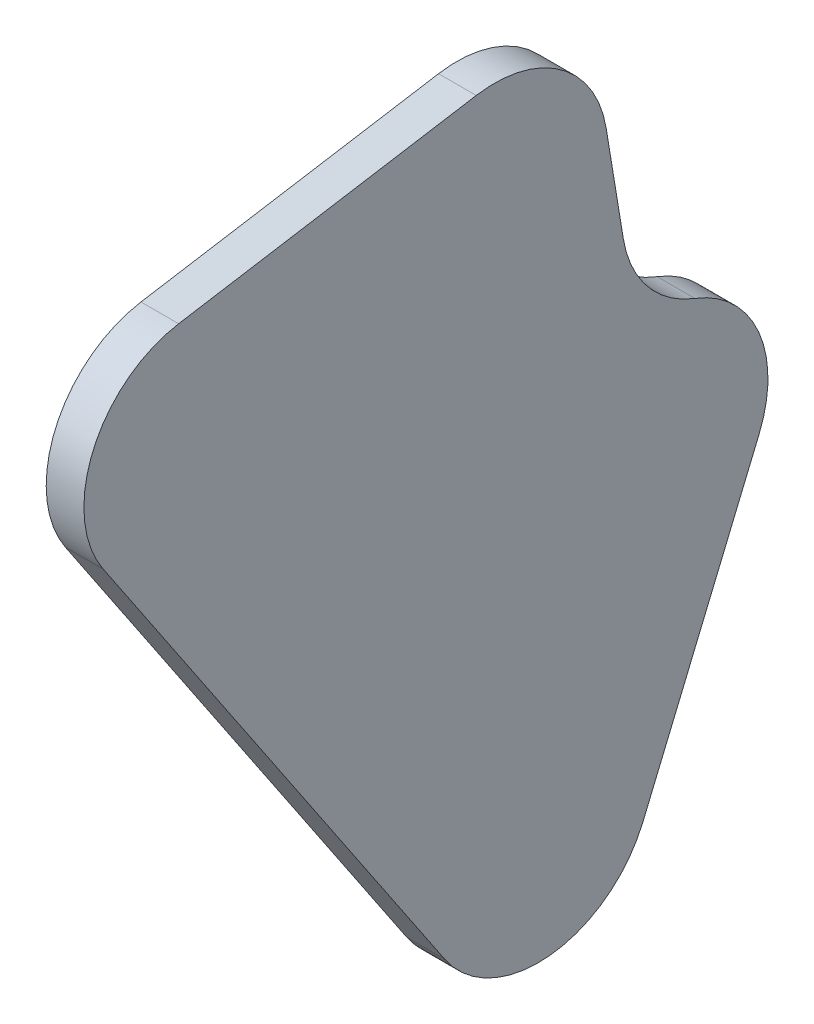
ISO-10303-21;
HEADER;
FILE_DESCRIPTION(('STEP AP214'),'2;1');
FILE_NAME('part.step','',(''),(''),'','','');
FILE_SCHEMA(('AUTOMOTIVE_DESIGN { 1 0 10303 214 1 1 1 1 }'));
ENDSEC;
DATA;
#1=APPLICATION_CONTEXT('core data for automotive mechanical design processes');
#2=APPLICATION_PROTOCOL_DEFINITION('international standard','automotive_design',2000,#1);
#3=PRODUCT_CONTEXT('',#1,'mechanical');
#4=PRODUCT('Part','Part','',(#3));
#5=PRODUCT_RELATED_PRODUCT_CATEGORY('part','',(#4));
#6=PRODUCT_DEFINITION_FORMATION('','',#4);
#7=PRODUCT_DEFINITION_CONTEXT('part definition',#1,'design');
#8=PRODUCT_DEFINITION('design','',#6,#7);
#9=PRODUCT_DEFINITION_SHAPE('','',#8);
#10=(LENGTH_UNIT() NAMED_UNIT(*) SI_UNIT(.MILLI.,.METRE.));
#11=(NAMED_UNIT(*) PLANE_ANGLE_UNIT() SI_UNIT($,.RADIAN.));
#12=(NAMED_UNIT(*) SI_UNIT($,.STERADIAN.) SOLID_ANGLE_UNIT());
#13=UNCERTAINTY_MEASURE_WITH_UNIT(LENGTH_MEASURE(1.E-05),#10,'distance_accuracy_value','');
#14=(GEOMETRIC_REPRESENTATION_CONTEXT(3) GLOBAL_UNCERTAINTY_ASSIGNED_CONTEXT((#13)) GLOBAL_UNIT_ASSIGNED_CONTEXT((#10,
#11,#12)) REPRESENTATION_CONTEXT('',''));
#15=CARTESIAN_POINT('',(0.,0.,0.));
#16=DIRECTION('',(0.,0.,1.));
#17=DIRECTION('',(1.,0.,0.));
#18=AXIS2_PLACEMENT_3D('',#15,#16,#17);
#19=CARTESIAN_POINT('',(69.5960624839999,335.894354488337,1115.98769704058));
#20=DIRECTION('',(-1.,0.,0.));
#21=DIRECTION('',(0.,0.,1.));
#22=AXIS2_PLACEMENT_3D('',#19,#20,#21);
#23=CYLINDRICAL_SURFACE('',#22,9.525);
#24=DIRECTION('',(-1.,0.,0.));
#25=VECTOR('',#24,1.);
#26=CARTESIAN_POINT('',(69.5960624839999,326.985934624614,1119.35899953838));
#27=LINE('',#26,#25);
#28=CARTESIAN_POINT('',(66.4210624839999,326.985934624614,1119.35899953838));
#29=VERTEX_POINT('',#28);
#30=CARTESIAN_POINT('',(69.5960624839999,326.985934624614,1119.35899953838));
#31=VERTEX_POINT('',#30);
#32=EDGE_CURVE('E130',#29,#31,#27,.F.);
#33=ORIENTED_EDGE('',*,*,#32,.F.);
#34=CARTESIAN_POINT('',(66.4210624839999,335.894354488337,1115.98769704058));
#35=DIRECTION('',(1.,0.,0.));
#36=DIRECTION('',(0.,0.,-1.));
#37=AXIS2_PLACEMENT_3D('',#34,#35,#36);
#38=CIRCLE('',#37,9.525);
#39=CARTESIAN_POINT('',(66.4210624839999,334.349666585887,1125.38660997156));
#40=VERTEX_POINT('',#39);
#41=EDGE_CURVE('E46',#29,#40,#38,.F.);
#42=ORIENTED_EDGE('',*,*,#41,.T.);
#43=DIRECTION('',(1.,0.,0.));
#44=VECTOR('',#43,1.);
#45=CARTESIAN_POINT('',(69.5960624839999,334.349666585887,1125.38660997156));
#46=LINE('',#45,#44);
#47=CARTESIAN_POINT('',(69.5960624839999,334.349666585887,1125.38660997156));
#48=VERTEX_POINT('',#47);
#49=EDGE_CURVE('E133',#48,#40,#46,.F.);
#50=ORIENTED_EDGE('',*,*,#49,.F.);
#51=CARTESIAN_POINT('',(69.5960624839999,335.894354488337,1115.98769704058));
#52=DIRECTION('',(1.,0.,0.));
#53=DIRECTION('',(0.,0.,-1.));
#54=AXIS2_PLACEMENT_3D('',#51,#52,#53);
#55=CIRCLE('',#54,9.525);
#56=EDGE_CURVE('E11',#48,#31,#55,.T.);
#57=ORIENTED_EDGE('',*,*,#56,.T.);
#58=EDGE_LOOP('',(#33,#42,#50,#57));
#59=FACE_BOUND('',#58,.T.);
#60=ADVANCED_FACE('F39',(#59),#23,.F.);
#61=CARTESIAN_POINT('',(69.5960624839999,294.645246765475,1132.53279236215));
#62=DIRECTION('',(-1.,0.,0.));
#63=DIRECTION('',(0.,0.,1.));
#64=AXIS2_PLACEMENT_3D('',#61,#62,#63);
#65=CYLINDRICAL_SURFACE('',#64,9.52500000000007);
#66=CARTESIAN_POINT('',(66.4210624839999,294.645246765475,1132.53279236215));
#67=DIRECTION('',(1.,0.,0.));
#68=DIRECTION('',(0.,0.,-1.));
#69=AXIS2_PLACEMENT_3D('',#66,#67,#68);
#70=CIRCLE('',#69,9.52500000000007);
#71=CARTESIAN_POINT('',(66.4210624839999,289.335537248944,1140.44054867163));
#72=VERTEX_POINT('',#71);
#73=CARTESIAN_POINT('',(66.4210624839999,290.969312893231,1123.74569186387));
#74=VERTEX_POINT('',#73);
#75=EDGE_CURVE('E129',#72,#74,#70,.T.);
#76=ORIENTED_EDGE('',*,*,#75,.T.);
#77=DIRECTION('',(-1.,0.,0.));
#78=VECTOR('',#77,1.);
#79=CARTESIAN_POINT('',(69.5960624839999,290.969312893231,1123.74569186387));
#80=LINE('',#79,#78);
#81=CARTESIAN_POINT('',(69.5960624839999,290.969312893231,1123.74569186387));
#82=VERTEX_POINT('',#81);
#83=EDGE_CURVE('E110',#82,#74,#80,.T.);
#84=ORIENTED_EDGE('',*,*,#83,.F.);
#85=CARTESIAN_POINT('',(69.5960624839999,294.645246765475,1132.53279236215));
#86=DIRECTION('',(1.,0.,0.));
#87=DIRECTION('',(0.,0.,-1.));
#88=AXIS2_PLACEMENT_3D('',#85,#86,#87);
#89=CIRCLE('',#88,9.52500000000007);
#90=CARTESIAN_POINT('',(69.5960624839999,289.335537248944,1140.44054867163));
#91=VERTEX_POINT('',#90);
#92=EDGE_CURVE('E116',#91,#82,#89,.T.);
#93=ORIENTED_EDGE('',*,*,#92,.F.);
#94=DIRECTION('',(-1.,0.,0.));
#95=VECTOR('',#94,1.);
#96=CARTESIAN_POINT('',(69.5960624839999,289.335537248944,1140.44054867163));
#97=LINE('',#96,#95);
#98=EDGE_CURVE('E166',#91,#72,#97,.T.);
#99=ORIENTED_EDGE('',*,*,#98,.T.);
#100=EDGE_LOOP('',(#76,#84,#93,#99));
#101=FACE_BOUND('',#100,.T.);
#102=ADVANCED_FACE('F127',(#101),#65,.T.);
#103=CARTESIAN_POINT('',(69.5960624839999,290.969312893231,1123.74569186387));
#104=DIRECTION('',(0.,0.385924815983592,0.922530236040007));
#105=DIRECTION('',(0.,-0.922530236040007,0.385924815983592));
#106=AXIS2_PLACEMENT_3D('',#103,#104,#105);
#107=PLANE('',#106);
#108=DIRECTION('',(0.,0.922530236040007,-0.385924815983592));
#109=VECTOR('',#108,1.);
#110=CARTESIAN_POINT('',(66.4210624839999,290.969312893231,1123.74569186387));
#111=LINE('',#110,#109);
#112=CARTESIAN_POINT('',(66.4210624839999,314.401580888648,1113.94320153789));
#113=VERTEX_POINT('',#112);
#114=EDGE_CURVE('E158',#74,#113,#111,.T.);
#115=ORIENTED_EDGE('',*,*,#114,.T.);
#116=DIRECTION('',(-1.,0.,0.));
#117=VECTOR('',#116,1.);
#118=CARTESIAN_POINT('',(69.5960624839999,314.401580888648,1113.94320153789));
#119=LINE('',#118,#117);
#120=CARTESIAN_POINT('',(69.5960624839999,314.401580888648,1113.94320153789));
#121=VERTEX_POINT('',#120);
#122=EDGE_CURVE('E113',#121,#113,#119,.T.);
#123=ORIENTED_EDGE('',*,*,#122,.F.);
#124=DIRECTION('',(0.,0.922530236040007,-0.385924815983592));
#125=VECTOR('',#124,1.);
#126=CARTESIAN_POINT('',(69.5960624839999,290.969312893231,1123.74569186387));
#127=LINE('',#126,#125);
#128=EDGE_CURVE('E106',#82,#121,#127,.T.);
#129=ORIENTED_EDGE('',*,*,#128,.F.);
#130=ORIENTED_EDGE('',*,*,#83,.T.);
#131=EDGE_LOOP('',(#115,#123,#129,#130));
#132=FACE_BOUND('',#131,.T.);
#133=ADVANCED_FACE('F108',(#132),#107,.F.);
#134=CARTESIAN_POINT('',(69.5960624839999,318.077514760891,1122.73030203617));
#135=DIRECTION('',(-1.,0.,0.));
#136=DIRECTION('',(0.,0.,1.));
#137=AXIS2_PLACEMENT_3D('',#134,#135,#136);
#138=CYLINDRICAL_SURFACE('',#137,9.52499999999995);
#139=CARTESIAN_POINT('',(66.4210624839999,318.077514760891,1122.73030203617));
#140=DIRECTION('',(1.,0.,0.));
#141=DIRECTION('',(0.,0.,-1.));
#142=AXIS2_PLACEMENT_3D('',#139,#140,#141);
#143=CIRCLE('',#142,9.52499999999995);
#144=EDGE_CURVE('E153',#113,#29,#143,.T.);
#145=ORIENTED_EDGE('',*,*,#144,.T.);
#146=ORIENTED_EDGE('',*,*,#32,.T.);
#147=CARTESIAN_POINT('',(69.5960624839999,318.077514760891,1122.73030203617));
#148=DIRECTION('',(1.,0.,0.));
#149=DIRECTION('',(0.,0.,-1.));
#150=AXIS2_PLACEMENT_3D('',#147,#148,#149);
#151=CIRCLE('',#150,9.52499999999995);
#152=EDGE_CURVE('E115',#121,#31,#151,.T.);
#153=ORIENTED_EDGE('',*,*,#152,.F.);
#154=ORIENTED_EDGE('',*,*,#122,.T.);
#155=EDGE_LOOP('',(#145,#146,#153,#154));
#156=FACE_BOUND('',#155,.T.);
#157=ADVANCED_FACE('F192',(#156),#138,.T.);
#158=CARTESIAN_POINT('',(69.5960624839999,343.144159772427,1126.83196299623));
#159=DIRECTION('',(0.,-0.162171958262426,0.98676251243819));
#160=DIRECTION('',(0.,-0.986762512438191,-0.162171958262426));
#161=AXIS2_PLACEMENT_3D('',#158,#159,#160);
#162=PLANE('',#161);
#163=DIRECTION('',(0.,0.98676251243819,0.162171958262426));
#164=VECTOR('',#163,1.);
#165=CARTESIAN_POINT('',(69.5960624839999,343.144159772427,1126.83196299623));
#166=LINE('',#165,#164);
#167=CARTESIAN_POINT('',(69.5960624839999,343.144159772427,1126.83196299623));
#168=VERTEX_POINT('',#167);
#169=EDGE_CURVE('E146',#48,#168,#166,.T.);
#170=ORIENTED_EDGE('',*,*,#169,.F.);
#171=ORIENTED_EDGE('',*,*,#49,.T.);
#172=DIRECTION('',(0.,0.98676251243819,0.162171958262426));
#173=VECTOR('',#172,1.);
#174=CARTESIAN_POINT('',(66.4210624839999,343.144159772427,1126.83196299623));
#175=LINE('',#174,#173);
#176=CARTESIAN_POINT('',(66.4210624839999,343.144159772427,1126.83196299623));
#177=VERTEX_POINT('',#176);
#178=EDGE_CURVE('E144',#40,#177,#175,.T.);
#179=ORIENTED_EDGE('',*,*,#178,.T.);
#180=DIRECTION('',(-1.,0.,0.));
#181=VECTOR('',#180,1.);
#182=CARTESIAN_POINT('',(69.5960624839999,343.144159772427,1126.83196299623));
#183=LINE('',#182,#181);
#184=EDGE_CURVE('E135',#168,#177,#183,.T.);
#185=ORIENTED_EDGE('',*,*,#184,.F.);
#186=EDGE_LOOP('',(#170,#171,#179,#185));
#187=FACE_BOUND('',#186,.T.);
#188=ADVANCED_FACE('F142',(#187),#162,.F.);
#189=CARTESIAN_POINT('',(69.5960624839999,341.599471869977,1136.2308759272));
#190=DIRECTION('',(-1.,0.,0.));
#191=DIRECTION('',(0.,0.,1.));
#192=AXIS2_PLACEMENT_3D('',#189,#190,#191);
#193=CYLINDRICAL_SURFACE('',#192,9.52499999999989);
#194=CARTESIAN_POINT('',(66.4210624839999,341.599471869977,1136.2308759272));
#195=DIRECTION('',(1.,0.,0.));
#196=DIRECTION('',(0.,0.,-1.));
#197=AXIS2_PLACEMENT_3D('',#194,#195,#196);
#198=CIRCLE('',#197,9.52499999999989);
#199=CARTESIAN_POINT('',(66.4210624839999,350.998384800951,1137.77556382965));
#200=VERTEX_POINT('',#199);
#201=EDGE_CURVE('E152',#177,#200,#198,.T.);
#202=ORIENTED_EDGE('',*,*,#201,.T.);
#203=DIRECTION('',(-1.,0.,0.));
#204=VECTOR('',#203,1.);
#205=CARTESIAN_POINT('',(69.5960624839999,350.998384800951,1137.77556382965));
#206=LINE('',#205,#204);
#207=CARTESIAN_POINT('',(69.5960624839999,350.998384800951,1137.77556382965));
#208=VERTEX_POINT('',#207);
#209=EDGE_CURVE('E174',#208,#200,#206,.T.);
#210=ORIENTED_EDGE('',*,*,#209,.F.);
#211=CARTESIAN_POINT('',(69.5960624839999,341.599471869977,1136.2308759272));
#212=DIRECTION('',(1.,0.,0.));
#213=DIRECTION('',(0.,0.,-1.));
#214=AXIS2_PLACEMENT_3D('',#211,#212,#213);
#215=CIRCLE('',#214,9.52499999999989);
#216=EDGE_CURVE('E180',#168,#208,#215,.T.);
#217=ORIENTED_EDGE('',*,*,#216,.F.);
#218=ORIENTED_EDGE('',*,*,#184,.T.);
#219=EDGE_LOOP('',(#202,#210,#217,#218));
#220=FACE_BOUND('',#219,.T.);
#221=ADVANCED_FACE('F178',(#220),#193,.T.);
#222=CARTESIAN_POINT('',(69.5960624839999,346.879217061085,1162.83933164558));
#223=DIRECTION('',(0.,-0.986762512438189,-0.162171958262434));
#224=DIRECTION('',(0.,0.162171958262434,-0.986762512438189));
#225=AXIS2_PLACEMENT_3D('',#222,#223,#224);
#226=PLANE('',#225);
#227=DIRECTION('',(0.,-0.162171958262434,0.986762512438189));
#228=VECTOR('',#227,1.);
#229=CARTESIAN_POINT('',(66.4210624839999,346.879217061085,1162.83933164558));
#230=LINE('',#229,#228);
#231=CARTESIAN_POINT('',(66.4210624839999,346.879217061085,1162.83933164558));
#232=VERTEX_POINT('',#231);
#233=EDGE_CURVE('E155',#200,#232,#230,.T.);
#234=ORIENTED_EDGE('',*,*,#233,.T.);
#235=DIRECTION('',(-1.,0.,0.));
#236=VECTOR('',#235,1.);
#237=CARTESIAN_POINT('',(69.5960624839999,346.879217061085,1162.83933164558));
#238=LINE('',#237,#236);
#239=CARTESIAN_POINT('',(69.5960624839999,346.879217061085,1162.83933164558));
#240=VERTEX_POINT('',#239);
#241=EDGE_CURVE('E171',#240,#232,#238,.T.);
#242=ORIENTED_EDGE('',*,*,#241,.F.);
#243=DIRECTION('',(0.,-0.162171958262434,0.986762512438189));
#244=VECTOR('',#243,1.);
#245=CARTESIAN_POINT('',(69.5960624839999,346.879217061085,1162.83933164558));
#246=LINE('',#245,#244);
#247=EDGE_CURVE('E182',#208,#240,#246,.T.);
#248=ORIENTED_EDGE('',*,*,#247,.F.);
#249=ORIENTED_EDGE('',*,*,#209,.T.);
#250=EDGE_LOOP('',(#234,#242,#248,#249));
#251=FACE_BOUND('',#250,.T.);
#252=ADVANCED_FACE('F209',(#251),#226,.F.);
#253=CARTESIAN_POINT('',(69.5960624839999,337.480304130111,1161.29464374313));
#254=DIRECTION('',(-1.,0.,0.));
#255=DIRECTION('',(0.,0.,1.));
#256=AXIS2_PLACEMENT_3D('',#253,#254,#255);
#257=CYLINDRICAL_SURFACE('',#256,9.52500000000006);
#258=CARTESIAN_POINT('',(66.4210624839999,337.480304130111,1161.29464374313));
#259=DIRECTION('',(1.,0.,0.));
#260=DIRECTION('',(0.,0.,-1.));
#261=AXIS2_PLACEMENT_3D('',#258,#259,#260);
#262=CIRCLE('',#261,9.52500000000006);
#263=CARTESIAN_POINT('',(66.4210624839999,332.17059461358,1169.20240005261));
#264=VERTEX_POINT('',#263);
#265=EDGE_CURVE('E163',#232,#264,#262,.T.);
#266=ORIENTED_EDGE('',*,*,#265,.T.);
#267=DIRECTION('',(-1.,0.,0.));
#268=VECTOR('',#267,1.);
#269=CARTESIAN_POINT('',(69.5960624839999,332.17059461358,1169.20240005261));
#270=LINE('',#269,#268);
#271=CARTESIAN_POINT('',(69.5960624839999,332.17059461358,1169.20240005261));
#272=VERTEX_POINT('',#271);
#273=EDGE_CURVE('E168',#272,#264,#270,.T.);
#274=ORIENTED_EDGE('',*,*,#273,.F.);
#275=CARTESIAN_POINT('',(69.5960624839999,337.480304130111,1161.29464374313));
#276=DIRECTION('',(1.,0.,0.));
#277=DIRECTION('',(0.,0.,-1.));
#278=AXIS2_PLACEMENT_3D('',#275,#276,#277);
#279=CIRCLE('',#278,9.52500000000006);
#280=EDGE_CURVE('E184',#240,#272,#279,.T.);
#281=ORIENTED_EDGE('',*,*,#280,.F.);
#282=ORIENTED_EDGE('',*,*,#241,.T.);
#283=EDGE_LOOP('',(#266,#274,#281,#282));
#284=FACE_BOUND('',#283,.T.);
#285=ADVANCED_FACE('F212',(#284),#257,.T.);
#286=CARTESIAN_POINT('',(69.5960624839999,332.17059461358,1169.20240005261));
#287=DIRECTION('',(0.,0.557449818008503,-0.830210636165477));
#288=DIRECTION('',(0.,0.830210636165477,0.557449818008503));
#289=AXIS2_PLACEMENT_3D('',#286,#287,#288);
#290=PLANE('',#289);
#291=DIRECTION('',(0.,-0.830210636165477,-0.557449818008503));
#292=VECTOR('',#291,1.);
#293=CARTESIAN_POINT('',(66.4210624839999,332.17059461358,1169.20240005261));
#294=LINE('',#293,#292);
#295=EDGE_CURVE('E125',#264,#72,#294,.T.);
#296=ORIENTED_EDGE('',*,*,#295,.T.);
#297=ORIENTED_EDGE('',*,*,#98,.F.);
#298=DIRECTION('',(0.,-0.830210636165477,-0.557449818008503));
#299=VECTOR('',#298,1.);
#300=CARTESIAN_POINT('',(69.5960624839999,332.17059461358,1169.20240005261));
#301=LINE('',#300,#299);
#302=EDGE_CURVE('E121',#272,#91,#301,.T.);
#303=ORIENTED_EDGE('',*,*,#302,.F.);
#304=ORIENTED_EDGE('',*,*,#273,.T.);
#305=EDGE_LOOP('',(#296,#297,#303,#304));
#306=FACE_BOUND('',#305,.T.);
#307=ADVANCED_FACE('F216',(#306),#290,.F.);
#308=CARTESIAN_POINT('',(69.5960624839999,294.645246765475,1132.53279236215));
#309=DIRECTION('',(1.,0.,0.));
#310=DIRECTION('',(0.,0.,-1.));
#311=AXIS2_PLACEMENT_3D('',#308,#309,#310);
#312=PLANE('',#311);
#313=ORIENTED_EDGE('',*,*,#56,.F.);
#314=ORIENTED_EDGE('',*,*,#169,.T.);
#315=ORIENTED_EDGE('',*,*,#216,.T.);
#316=ORIENTED_EDGE('',*,*,#247,.T.);
#317=ORIENTED_EDGE('',*,*,#280,.T.);
#318=ORIENTED_EDGE('',*,*,#302,.T.);
#319=ORIENTED_EDGE('',*,*,#92,.T.);
#320=ORIENTED_EDGE('',*,*,#128,.T.);
#321=ORIENTED_EDGE('',*,*,#152,.T.);
#322=EDGE_LOOP('',(#313,#314,#315,#316,#317,#318,#319,#320,#321));
#323=FACE_BOUND('',#322,.T.);
#324=ADVANCED_FACE('F119',(#323),#312,.T.);
#325=CARTESIAN_POINT('',(66.4210624839999,294.645246765475,1132.53279236215));
#326=DIRECTION('',(1.,0.,0.));
#327=DIRECTION('',(0.,0.,-1.));
#328=AXIS2_PLACEMENT_3D('',#325,#326,#327);
#329=PLANE('',#328);
#330=ORIENTED_EDGE('',*,*,#75,.F.);
#331=ORIENTED_EDGE('',*,*,#295,.F.);
#332=ORIENTED_EDGE('',*,*,#265,.F.);
#333=ORIENTED_EDGE('',*,*,#233,.F.);
#334=ORIENTED_EDGE('',*,*,#201,.F.);
#335=ORIENTED_EDGE('',*,*,#178,.F.);
#336=ORIENTED_EDGE('',*,*,#41,.F.);
#337=ORIENTED_EDGE('',*,*,#144,.F.);
#338=ORIENTED_EDGE('',*,*,#114,.F.);
#339=EDGE_LOOP('',(#330,#331,#332,#333,#334,#335,#336,#337,#338));
#340=FACE_BOUND('',#339,.T.);
#341=ADVANCED_FACE('F149',(#340),#329,.F.);
#342=CLOSED_SHELL('',(#60,#102,#133,#157,#188,#221,#252,#285,#307,#324,#341));
#343=MANIFOLD_SOLID_BREP('B2',#342);
#344=ADVANCED_BREP_SHAPE_REPRESENTATION('',(#18,#343),#14);
#345=SHAPE_DEFINITION_REPRESENTATION(#9,#344);
ENDSEC;
END-ISO-10303-21;
